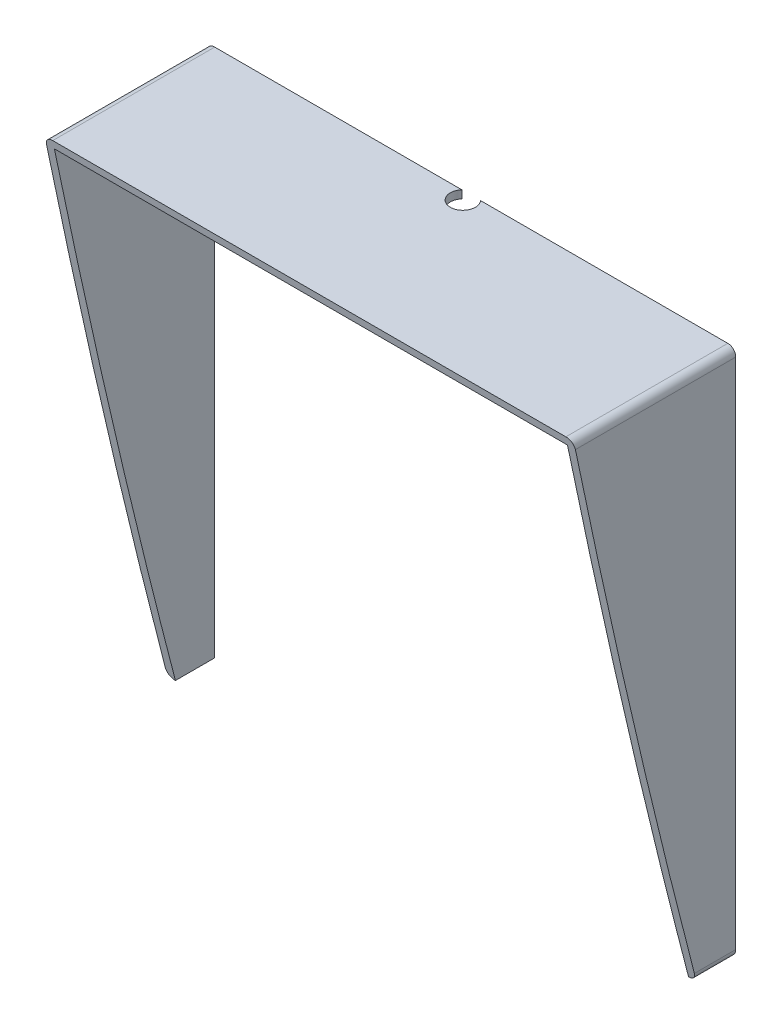
ISO-10303-21;
HEADER;
FILE_DESCRIPTION(('STEP AP214'),'2;1');
FILE_NAME('part.step','',(''),(''),'','','');
FILE_SCHEMA(('AUTOMOTIVE_DESIGN { 1 0 10303 214 1 1 1 1 }'));
ENDSEC;
DATA;
#1=APPLICATION_CONTEXT('core data for automotive mechanical design processes');
#2=APPLICATION_PROTOCOL_DEFINITION('international standard','automotive_design',2000,#1);
#3=PRODUCT_CONTEXT('',#1,'mechanical');
#4=PRODUCT('Part','Part','',(#3));
#5=PRODUCT_RELATED_PRODUCT_CATEGORY('part','',(#4));
#6=PRODUCT_DEFINITION_FORMATION('','',#4);
#7=PRODUCT_DEFINITION_CONTEXT('part definition',#1,'design');
#8=PRODUCT_DEFINITION('design','',#6,#7);
#9=PRODUCT_DEFINITION_SHAPE('','',#8);
#10=(LENGTH_UNIT() NAMED_UNIT(*) SI_UNIT(.MILLI.,.METRE.));
#11=(NAMED_UNIT(*) PLANE_ANGLE_UNIT() SI_UNIT($,.RADIAN.));
#12=(NAMED_UNIT(*) SI_UNIT($,.STERADIAN.) SOLID_ANGLE_UNIT());
#13=UNCERTAINTY_MEASURE_WITH_UNIT(LENGTH_MEASURE(1.E-05),#10,'distance_accuracy_value','');
#14=(GEOMETRIC_REPRESENTATION_CONTEXT(3) GLOBAL_UNCERTAINTY_ASSIGNED_CONTEXT((#13)) GLOBAL_UNIT_ASSIGNED_CONTEXT((#10,
#11,#12)) REPRESENTATION_CONTEXT('',''));
#15=CARTESIAN_POINT('',(0.,0.,0.));
#16=DIRECTION('',(0.,0.,1.));
#17=DIRECTION('',(1.,0.,0.));
#18=AXIS2_PLACEMENT_3D('',#15,#16,#17);
#19=CARTESIAN_POINT('',(-97.,97.,0.));
#20=DIRECTION('',(0.,0.,1.));
#21=DIRECTION('',(1.,0.,0.));
#22=AXIS2_PLACEMENT_3D('',#19,#20,#21);
#23=PLANE('',#22);
#24=DIRECTION('',(-1.,0.,0.));
#25=VECTOR('',#24,1.);
#26=CARTESIAN_POINT('',(97.,100.,0.));
#27=LINE('',#26,#25);
#28=CARTESIAN_POINT('',(-3.54044096437457,100.,0.));
#29=VERTEX_POINT('',#28);
#30=CARTESIAN_POINT('',(-97.,100.,0.));
#31=VERTEX_POINT('',#30);
#32=EDGE_CURVE('E202',#29,#31,#27,.T.);
#33=ORIENTED_EDGE('',*,*,#32,.F.);
#34=DIRECTION('',(0.,-1.,0.));
#35=VECTOR('',#34,1.);
#36=CARTESIAN_POINT('',(-3.54044096437457,107.,0.));
#37=LINE('',#36,#35);
#38=CARTESIAN_POINT('',(-3.54044096437457,97.,0.));
#39=VERTEX_POINT('',#38);
#40=EDGE_CURVE('E171',#29,#39,#37,.T.);
#41=ORIENTED_EDGE('',*,*,#40,.T.);
#42=DIRECTION('',(-1.,0.,0.));
#43=VECTOR('',#42,1.);
#44=CARTESIAN_POINT('',(97.,97.,0.));
#45=LINE('',#44,#43);
#46=CARTESIAN_POINT('',(-97.,97.,0.));
#47=VERTEX_POINT('',#46);
#48=EDGE_CURVE('E161',#39,#47,#45,.T.);
#49=ORIENTED_EDGE('',*,*,#48,.T.);
#50=DIRECTION('',(0.,-1.,0.));
#51=VECTOR('',#50,1.);
#52=CARTESIAN_POINT('',(-97.,97.,0.));
#53=LINE('',#52,#51);
#54=CARTESIAN_POINT('',(-97.,-100.,0.));
#55=VERTEX_POINT('',#54);
#56=EDGE_CURVE('E168',#47,#55,#53,.T.);
#57=ORIENTED_EDGE('',*,*,#56,.T.);
#58=CARTESIAN_POINT('',(-97.,-97.,0.));
#59=DIRECTION('',(0.,0.,1.));
#60=DIRECTION('',(1.,0.,0.));
#61=AXIS2_PLACEMENT_3D('',#58,#59,#60);
#62=CIRCLE('',#61,3.);
#63=CARTESIAN_POINT('',(-100.,-97.,0.));
#64=VERTEX_POINT('',#63);
#65=EDGE_CURVE('E184',#64,#55,#62,.T.);
#66=ORIENTED_EDGE('',*,*,#65,.F.);
#67=DIRECTION('',(0.,-1.,0.));
#68=VECTOR('',#67,1.);
#69=CARTESIAN_POINT('',(-100.,97.,0.));
#70=LINE('',#69,#68);
#71=CARTESIAN_POINT('',(-100.,97.,0.));
#72=VERTEX_POINT('',#71);
#73=EDGE_CURVE('E180',#72,#64,#70,.T.);
#74=ORIENTED_EDGE('',*,*,#73,.F.);
#75=CARTESIAN_POINT('',(-97.,97.,0.));
#76=DIRECTION('',(0.,0.,1.));
#77=DIRECTION('',(1.,0.,0.));
#78=AXIS2_PLACEMENT_3D('',#75,#76,#77);
#79=CIRCLE('',#78,3.);
#80=EDGE_CURVE('E206',#31,#72,#79,.T.);
#81=ORIENTED_EDGE('',*,*,#80,.F.);
#82=EDGE_LOOP('',(#33,#41,#49,#57,#66,#74,#81));
#83=FACE_BOUND('',#82,.T.);
#84=ADVANCED_FACE('F75',(#83),#23,.F.);
#85=CARTESIAN_POINT('',(97.,97.,0.));
#86=VERTEX_POINT('',#85);
#87=CARTESIAN_POINT('',(3.54044096437476,97.,0.));
#88=VERTEX_POINT('',#87);
#89=EDGE_CURVE('E156',#86,#88,#45,.T.);
#90=ORIENTED_EDGE('',*,*,#89,.T.);
#91=DIRECTION('',(0.,-1.,0.));
#92=VECTOR('',#91,1.);
#93=CARTESIAN_POINT('',(3.54044096437476,107.,0.));
#94=LINE('',#93,#92);
#95=CARTESIAN_POINT('',(3.54044096437476,100.,0.));
#96=VERTEX_POINT('',#95);
#97=EDGE_CURVE('E94',#88,#96,#94,.F.);
#98=ORIENTED_EDGE('',*,*,#97,.T.);
#99=CARTESIAN_POINT('',(97.,100.,0.));
#100=VERTEX_POINT('',#99);
#101=EDGE_CURVE('E153',#100,#96,#27,.T.);
#102=ORIENTED_EDGE('',*,*,#101,.F.);
#103=CARTESIAN_POINT('',(97.,97.,0.));
#104=DIRECTION('',(0.,0.,1.));
#105=DIRECTION('',(1.,0.,0.));
#106=AXIS2_PLACEMENT_3D('',#103,#104,#105);
#107=CIRCLE('',#106,3.);
#108=CARTESIAN_POINT('',(100.,97.,0.));
#109=VERTEX_POINT('',#108);
#110=EDGE_CURVE('E198',#109,#100,#107,.T.);
#111=ORIENTED_EDGE('',*,*,#110,.F.);
#112=DIRECTION('',(0.,1.,0.));
#113=VECTOR('',#112,1.);
#114=CARTESIAN_POINT('',(100.,-97.,0.));
#115=LINE('',#114,#113);
#116=CARTESIAN_POINT('',(100.,-97.,0.));
#117=VERTEX_POINT('',#116);
#118=EDGE_CURVE('E194',#117,#109,#115,.T.);
#119=ORIENTED_EDGE('',*,*,#118,.F.);
#120=CARTESIAN_POINT('',(97.,-97.,0.));
#121=DIRECTION('',(0.,0.,1.));
#122=DIRECTION('',(1.,0.,0.));
#123=AXIS2_PLACEMENT_3D('',#120,#121,#122);
#124=CIRCLE('',#123,3.);
#125=CARTESIAN_POINT('',(96.9999999999999,-100.,0.));
#126=VERTEX_POINT('',#125);
#127=EDGE_CURVE('E167',#126,#117,#124,.T.);
#128=ORIENTED_EDGE('',*,*,#127,.F.);
#129=DIRECTION('',(0.,1.,0.));
#130=VECTOR('',#129,1.);
#131=CARTESIAN_POINT('',(97.,-97.,0.));
#132=LINE('',#131,#130);
#133=EDGE_CURVE('E148',#126,#86,#132,.T.);
#134=ORIENTED_EDGE('',*,*,#133,.T.);
#135=EDGE_LOOP('',(#90,#98,#102,#111,#119,#128,#134));
#136=FACE_BOUND('',#135,.T.);
#137=ADVANCED_FACE('F164',(#136),#23,.F.);
#138=CARTESIAN_POINT('',(-97.,97.,233.360213599289));
#139=DIRECTION('',(0.,0.,-1.));
#140=DIRECTION('',(-1.,0.,0.));
#141=AXIS2_PLACEMENT_3D('',#138,#139,#140);
#142=CYLINDRICAL_SURFACE('',#141,3.);
#143=DIRECTION('',(0.,0.,-1.));
#144=VECTOR('',#143,1.);
#145=CARTESIAN_POINT('',(-100.,97.,233.360213599289));
#146=LINE('',#145,#144);
#147=CARTESIAN_POINT('',(-100.,97.0000000015854,60.6130762424719));
#148=VERTEX_POINT('',#147);
#149=EDGE_CURVE('E178',#148,#72,#146,.T.);
#150=ORIENTED_EDGE('',*,*,#149,.F.);
#151=CARTESIAN_POINT('',(-100.,97.,60.6130762421445));
#152=CARTESIAN_POINT('',(-100.000007100054,97.0856880026168,60.6307707751174));
#153=CARTESIAN_POINT('',(-99.9963287509131,97.1713732623864,60.6484621380416));
#154=CARTESIAN_POINT('',(-99.9816560796996,97.3421414551059,60.6837154599153));
#155=CARTESIAN_POINT('',(-99.9706617978497,97.4272243913647,60.7012774195757));
#156=CARTESIAN_POINT('',(-99.9414142967146,97.5961798555819,60.7361465513628));
#157=CARTESIAN_POINT('',(-99.9231621255235,97.6800525564959,60.7534537599033));
#158=CARTESIAN_POINT('',(-99.8795302255661,97.8459754505165,60.7876873670131));
#159=CARTESIAN_POINT('',(-99.8541506421178,97.9280256807439,60.8046137733386));
#160=CARTESIAN_POINT('',(-99.7674816393416,98.1706801868427,60.8546649831489));
#161=CARTESIAN_POINT('',(-99.6956564207911,98.3278202419441,60.8870683739158));
#162=CARTESIAN_POINT('',(-99.525885414694,98.6277678277151,60.9489046485199));
#163=CARTESIAN_POINT('',(-99.4279487932262,98.7705803637144,60.9783385697639));
#164=CARTESIAN_POINT('',(-99.2096127536016,99.0363903607402,61.0331109183102));
#165=CARTESIAN_POINT('',(-99.0894432692385,99.1595685676855,61.058486711257));
#166=CARTESIAN_POINT('',(-98.8292827857296,99.3839527654858,61.1047038732665));
#167=CARTESIAN_POINT('',(-98.6892888505607,99.4851554961139,61.1255445695146));
#168=CARTESIAN_POINT('',(-98.3964455527121,99.6605469856351,61.16165830404));
#169=CARTESIAN_POINT('',(-98.2439027497817,99.7352273616381,61.177032672776));
#170=CARTESIAN_POINT('',(-97.9280637731349,99.8578542143945,61.2022756745486));
#171=CARTESIAN_POINT('',(-97.7647772858595,99.9058244133696,61.212149193083));
#172=CARTESIAN_POINT('',(-97.5001599770955,99.9597244006013,61.2232428326046));
#173=CARTESIAN_POINT('',(-97.4006830354952,99.9748193261081,61.2263495344302));
#174=CARTESIAN_POINT('',(-97.200819910882,99.9949540541081,61.2304934197249));
#175=CARTESIAN_POINT('',(-97.1004352519509,100.000008375793,61.2315335914952));
#176=CARTESIAN_POINT('',(-97.0000000000001,100.,61.2315319001184));
#177=B_SPLINE_CURVE_WITH_KNOTS('',3,(#151,#152,#153,#154,#155,#156,#157,#158,#159,#160,#161,
#162,#163,#164,#165,#166,#167,#168,#169,#170,#171,#172,#173,#174,#175,#176),.UNSPECIFIED.,.F.,
.F.,(4,2,2,2,2,2,2,2,2,2,2,2,4),(0.,0.262404202490615,0.524806962316488,0.787171842958766,
1.04953137474283,1.57415237436955,2.09858945433025,2.61787860807826,3.13724474971434,
3.64640829512043,4.15511891072351,4.45662961662765,4.75770400537536),.UNSPECIFIED.);
#178=CARTESIAN_POINT('',(-97.0000000000001,99.9999999999999,61.2315319001184));
#179=VERTEX_POINT('',#178);
#180=EDGE_CURVE('E103',#148,#179,#177,.T.);
#181=ORIENTED_EDGE('',*,*,#180,.T.);
#182=DIRECTION('',(0.,0.,-1.));
#183=VECTOR('',#182,1.);
#184=CARTESIAN_POINT('',(-97.,100.,233.360213599289));
#185=LINE('',#184,#183);
#186=EDGE_CURVE('E204',#179,#31,#185,.T.);
#187=ORIENTED_EDGE('',*,*,#186,.T.);
#188=ORIENTED_EDGE('',*,*,#80,.T.);
#189=EDGE_LOOP('',(#150,#181,#187,#188));
#190=FACE_BOUND('',#189,.T.);
#191=ADVANCED_FACE('F219',(#190),#142,.T.);
#192=CARTESIAN_POINT('',(-100.,97.,233.360213599289));
#193=DIRECTION('',(1.,0.,0.));
#194=DIRECTION('',(0.,1.,0.));
#195=AXIS2_PLACEMENT_3D('',#192,#193,#194);
#196=PLANE('',#195);
#197=DIRECTION('',(0.,0.,-1.));
#198=VECTOR('',#197,1.);
#199=CARTESIAN_POINT('',(-100.,-97.,233.360213599289));
#200=LINE('',#199,#198);
#201=CARTESIAN_POINT('',(-100.,-97.,15.6242073781726));
#202=VERTEX_POINT('',#201);
#203=EDGE_CURVE('E182',#202,#64,#200,.T.);
#204=ORIENTED_EDGE('',*,*,#203,.F.);
#205=CARTESIAN_POINT('',(-100.,821.32936142745,227.601217320556));
#206=CARTESIAN_POINT('',(-100.,814.013340356773,232.250751676992));
#207=CARTESIAN_POINT('',(-100.,807.890062740785,233.357963599289));
#208=CARTESIAN_POINT('',(-100.,752.770792852457,214.336934546945));
#209=CARTESIAN_POINT('',(-100.,674.079077361076,175.267095142982));
#210=CARTESIAN_POINT('',(-100.,488.513772650182,127.413622560773));
#211=CARTESIAN_POINT('',(-100.,166.664225990946,81.1075939794665));
#212=CARTESIAN_POINT('',(-100.,-207.087491188463,0.397268381274574));
#213=CARTESIAN_POINT('',(-100.,-425.4,-93.8780602923125));
#214=B_SPLINE_CURVE_WITH_KNOTS('',3,(#205,#206,#207,#208,#209,#210,#211,#212,#213),
.UNSPECIFIED.,.F.,.F.,(4,1,1,1,1,1,4),(0.,0.0188245230898064,0.0375633418946969,
0.170740982920659,0.210775946768388,0.421265775243738,1.),.UNSPECIFIED.);
#215=EDGE_CURVE('E181',#202,#148,#214,.F.);
#216=ORIENTED_EDGE('',*,*,#215,.T.);
#217=ORIENTED_EDGE('',*,*,#149,.T.);
#218=ORIENTED_EDGE('',*,*,#73,.T.);
#219=EDGE_LOOP('',(#204,#216,#217,#218));
#220=FACE_BOUND('',#219,.T.);
#221=ADVANCED_FACE('F224',(#220),#196,.F.);
#222=CARTESIAN_POINT('',(-97.,-97.,233.360213599289));
#223=DIRECTION('',(0.,0.,-1.));
#224=DIRECTION('',(-1.,0.,0.));
#225=AXIS2_PLACEMENT_3D('',#222,#223,#224);
#226=CYLINDRICAL_SURFACE('',#225,3.);
#227=DIRECTION('',(0.,0.,-1.));
#228=VECTOR('',#227,1.);
#229=CARTESIAN_POINT('',(-97.,-100.,233.360213599289));
#230=LINE('',#229,#228);
#231=CARTESIAN_POINT('',(-97.0000000000002,-100.,14.8408458443055));
#232=VERTEX_POINT('',#231);
#233=EDGE_CURVE('E186',#232,#55,#230,.T.);
#234=ORIENTED_EDGE('',*,*,#233,.F.);
#235=CARTESIAN_POINT('',(-97.,-100.,14.8408458443055));
#236=CARTESIAN_POINT('',(-97.082392301401,-100.000009490196,14.8408433369679));
#237=CARTESIAN_POINT('',(-97.1647799083764,-99.9966058700731,14.8417338347966));
#238=CARTESIAN_POINT('',(-97.3289500804342,-99.9830455162141,14.8452815366397));
#239=CARTESIAN_POINT('',(-97.4107327132783,-99.9728895507387,14.8479385396668));
#240=CARTESIAN_POINT('',(-97.5729818090605,-99.9459199372928,14.8549941075903));
#241=CARTESIAN_POINT('',(-97.653450227733,-99.9291173450635,14.8593897804499));
#242=CARTESIAN_POINT('',(-97.8126148061725,-99.8890140831846,14.8698805877941));
#243=CARTESIAN_POINT('',(-97.8913109651344,-99.8657134105828,14.8759757230509));
#244=CARTESIAN_POINT('',(-98.1239374649887,-99.7863142304628,14.8967442836812));
#245=CARTESIAN_POINT('',(-98.2745259116123,-99.7206984069387,14.9139061375583));
#246=CARTESIAN_POINT('',(-98.5623117630588,-99.5662999868688,14.9542821334835));
#247=CARTESIAN_POINT('',(-98.6995080520835,-99.4775154622299,14.9774967792432));
#248=CARTESIAN_POINT('',(-98.9589197399221,-99.2781034043576,15.0296262744241));
#249=CARTESIAN_POINT('',(-99.0808981985866,-99.1671871446118,15.0586164617199));
#250=CARTESIAN_POINT('',(-99.3045872820295,-98.9276287373059,15.1212141384857));
#251=CARTESIAN_POINT('',(-99.406293038356,-98.798982344403,15.154822733792));
#252=CARTESIAN_POINT('',(-99.5898864424123,-98.5233987424396,15.2267983210333));
#253=CARTESIAN_POINT('',(-99.6710641423571,-98.3760189984249,15.2652803046912));
#254=CARTESIAN_POINT('',(-99.8075179427542,-98.0704352397623,15.3450459630727));
#255=CARTESIAN_POINT('',(-99.8627975511805,-97.912232694424,15.3863292574828));
#256=CARTESIAN_POINT('',(-99.9362520818087,-97.6280958586719,15.4604515884955));
#257=CARTESIAN_POINT('',(-99.9601441447508,-97.5035136825579,15.4929434882032));
#258=CARTESIAN_POINT('',(-99.9920186416349,-97.2526331975978,15.5583589698145));
#259=CARTESIAN_POINT('',(-100.000023559898,-97.1263375691372,15.5912818751695));
#260=CARTESIAN_POINT('',(-100.,-97.,15.6242073781726));
#261=B_SPLINE_CURVE_WITH_KNOTS('',3,(#235,#236,#237,#238,#239,#240,#241,#242,#243,#244,#245,
#246,#247,#248,#249,#250,#251,#252,#253,#254,#255,#256,#257,#258,#259,#260),.UNSPECIFIED.,.F.,
.F.,(4,2,2,2,2,2,2,2,2,2,2,2,4),(0.,0.247093587719547,0.494159066725783,0.740815303101802,
0.987471651539334,1.48042332805695,1.97341604097017,2.47331895925039,2.97334178403566,
3.48882409732194,4.00423656678551,4.39613879672963,4.78748598942122),.UNSPECIFIED.);
#262=EDGE_CURVE('E185',#232,#202,#261,.T.);
#263=ORIENTED_EDGE('',*,*,#262,.T.);
#264=ORIENTED_EDGE('',*,*,#203,.T.);
#265=ORIENTED_EDGE('',*,*,#65,.T.);
#266=EDGE_LOOP('',(#234,#263,#264,#265));
#267=FACE_BOUND('',#266,.T.);
#268=ADVANCED_FACE('F339',(#267),#226,.T.);
#269=CARTESIAN_POINT('',(97.,-97.,233.360213599289));
#270=DIRECTION('',(0.,0.,-1.));
#271=DIRECTION('',(-1.,0.,0.));
#272=AXIS2_PLACEMENT_3D('',#269,#270,#271);
#273=CYLINDRICAL_SURFACE('',#272,3.);
#274=DIRECTION('',(0.,0.,-1.));
#275=VECTOR('',#274,1.);
#276=CARTESIAN_POINT('',(100.,-97.,233.360213599289));
#277=LINE('',#276,#275);
#278=CARTESIAN_POINT('',(99.9999999999999,-97.0000000029362,15.6242073774073));
#279=VERTEX_POINT('',#278);
#280=EDGE_CURVE('E192',#279,#117,#277,.T.);
#281=ORIENTED_EDGE('',*,*,#280,.F.);
#282=CARTESIAN_POINT('',(100.,-97.,15.6242073781726));
#283=CARTESIAN_POINT('',(100.000006492503,-97.0864954464646,15.6016652732155));
#284=CARTESIAN_POINT('',(99.9962592013464,-97.1729869554062,15.5791203601685));
#285=CARTESIAN_POINT('',(99.9813082142559,-97.3453640758507,15.5341810346435));
#286=CARTESIAN_POINT('',(99.9701043895374,-97.4312496768629,15.5117866247716));
#287=CARTESIAN_POINT('',(99.9402882521572,-97.6018325179434,15.467300364239));
#288=CARTESIAN_POINT('',(99.921674325267,-97.6865294949154,15.4452085805882));
#289=CARTESIAN_POINT('',(99.8771627053963,-97.8540837243244,15.401497876626));
#290=CARTESIAN_POINT('',(99.8512651913195,-97.9369410218947,15.3798789447142));
#291=CARTESIAN_POINT('',(99.7627864775551,-98.1819992478645,15.3159289072289));
#292=CARTESIAN_POINT('',(99.6894169837518,-98.3406986427169,15.2745013955485));
#293=CARTESIAN_POINT('',(99.5158186015368,-98.6435135609017,15.1954311195241));
#294=CARTESIAN_POINT('',(99.4156018471881,-98.7876356322583,15.1577866559125));
#295=CARTESIAN_POINT('',(99.192614687147,-99.0548048008822,15.0879854174616));
#296=CARTESIAN_POINT('',(99.0702238668954,-99.1781477595502,15.0557516324786));
#297=CARTESIAN_POINT('',(98.8051189773957,-99.4024327535476,14.9971266269117));
#298=CARTESIAN_POINT('',(98.662402661511,-99.5033723094035,14.9707360530201));
#299=CARTESIAN_POINT('',(98.3655563277829,-99.6765401554903,14.9254547931294));
#300=CARTESIAN_POINT('',(98.2119255340124,-99.7495705902181,14.9063545959361));
#301=CARTESIAN_POINT('',(97.8939698419028,-99.8687213924199,14.8751893832268));
#302=CARTESIAN_POINT('',(97.7296566317682,-99.9148706390132,14.8631168177626));
#303=CARTESIAN_POINT('',(97.469920894112,-99.9644743536439,14.8501400983555));
#304=CARTESIAN_POINT('',(97.3764003233928,-99.9777897135211,14.8466565613292));
#305=CARTESIAN_POINT('',(97.18860218304,-99.9955487321418,14.8420104118401));
#306=CARTESIAN_POINT('',(97.0943259236797,-100.000005364093,14.8408444054583));
#307=CARTESIAN_POINT('',(97.,-99.9999999999999,14.8408458443055));
#308=B_SPLINE_CURVE_WITH_KNOTS('',3,(#282,#283,#284,#285,#286,#287,#288,#289,#290,#291,#292,
#293,#294,#295,#296,#297,#298,#299,#300,#301,#302,#303,#304,#305,#306,#307),.UNSPECIFIED.,.F.,
.F.,(4,2,2,2,2,2,2,2,2,2,2,2,4),(0.,0.26806947746696,0.536143584972862,0.804276122151919,
1.07240207387375,1.6086163065243,2.14458859597983,2.67212963302886,3.19972902605742,
3.71075865870553,4.22123826225042,4.50442128557257,4.78718929367573),.UNSPECIFIED.);
#309=CARTESIAN_POINT('',(97.,-100.,14.8408458443055));
#310=VERTEX_POINT('',#309);
#311=EDGE_CURVE('E189',#279,#310,#308,.T.);
#312=ORIENTED_EDGE('',*,*,#311,.T.);
#313=DIRECTION('',(0.,0.,-1.));
#314=VECTOR('',#313,1.);
#315=CARTESIAN_POINT('',(97.,-100.,233.360213599289));
#316=LINE('',#315,#314);
#317=EDGE_CURVE('E190',#310,#126,#316,.T.);
#318=ORIENTED_EDGE('',*,*,#317,.T.);
#319=ORIENTED_EDGE('',*,*,#127,.T.);
#320=EDGE_LOOP('',(#281,#312,#318,#319));
#321=FACE_BOUND('',#320,.T.);
#322=ADVANCED_FACE('F397',(#321),#273,.T.);
#323=CARTESIAN_POINT('',(100.,-97.,233.360213599289));
#324=DIRECTION('',(-1.,0.,0.));
#325=DIRECTION('',(0.,-1.,0.));
#326=AXIS2_PLACEMENT_3D('',#323,#324,#325);
#327=PLANE('',#326);
#328=DIRECTION('',(0.,0.,-1.));
#329=VECTOR('',#328,1.);
#330=CARTESIAN_POINT('',(100.,97.,233.360213599289));
#331=LINE('',#330,#329);
#332=CARTESIAN_POINT('',(99.9999999999999,97.,60.6130762421445));
#333=VERTEX_POINT('',#332);
#334=EDGE_CURVE('E196',#333,#109,#331,.T.);
#335=ORIENTED_EDGE('',*,*,#334,.F.);
#336=CARTESIAN_POINT('',(99.9999999999998,821.32936142745,227.601217320556));
#337=CARTESIAN_POINT('',(99.9999999999998,814.013340356773,232.250751676992));
#338=CARTESIAN_POINT('',(99.9999999999998,807.890062740785,233.357963599289));
#339=CARTESIAN_POINT('',(99.9999999999998,752.770792852457,214.336934546945));
#340=CARTESIAN_POINT('',(99.9999999999998,674.079077361076,175.267095142982));
#341=CARTESIAN_POINT('',(99.9999999999998,488.513772650182,127.413622560773));
#342=CARTESIAN_POINT('',(99.9999999999998,166.664225990946,81.1075939794665));
#343=CARTESIAN_POINT('',(99.9999999999999,-207.087491188463,0.397268381274574));
#344=CARTESIAN_POINT('',(99.9999999999999,-425.4,-93.8780602923125));
#345=B_SPLINE_CURVE_WITH_KNOTS('',3,(#336,#337,#338,#339,#340,#341,#342,#343,#344),
.UNSPECIFIED.,.F.,.F.,(4,1,1,1,1,1,4),(0.,0.0188245230898064,0.0375633418946969,
0.170740982920659,0.210775946768388,0.421265775243738,1.),.UNSPECIFIED.);
#346=EDGE_CURVE('E195',#333,#279,#345,.T.);
#347=ORIENTED_EDGE('',*,*,#346,.T.);
#348=ORIENTED_EDGE('',*,*,#280,.T.);
#349=ORIENTED_EDGE('',*,*,#118,.T.);
#350=EDGE_LOOP('',(#335,#347,#348,#349));
#351=FACE_BOUND('',#350,.T.);
#352=ADVANCED_FACE('F256',(#351),#327,.F.);
#353=CARTESIAN_POINT('',(97.,97.,233.360213599289));
#354=DIRECTION('',(0.,0.,-1.));
#355=DIRECTION('',(-1.,0.,0.));
#356=AXIS2_PLACEMENT_3D('',#353,#354,#355);
#357=CYLINDRICAL_SURFACE('',#356,3.);
#358=DIRECTION('',(0.,0.,-1.));
#359=VECTOR('',#358,1.);
#360=CARTESIAN_POINT('',(97.,100.,233.360213599289));
#361=LINE('',#360,#359);
#362=CARTESIAN_POINT('',(97.,100.,61.2315319001185));
#363=VERTEX_POINT('',#362);
#364=EDGE_CURVE('E200',#363,#100,#361,.T.);
#365=ORIENTED_EDGE('',*,*,#364,.F.);
#366=CARTESIAN_POINT('',(97.,100.,61.2315319001184));
#367=CARTESIAN_POINT('',(97.0831224657888,100.000008987514,61.2315337324498));
#368=CARTESIAN_POINT('',(97.1662405610942,99.9965454123548,61.2308209277612));
#369=CARTESIAN_POINT('',(97.3318723384336,99.9827424667997,61.2279801870044));
#370=CARTESIAN_POINT('',(97.4143860736197,99.9724037085864,61.2258523769315));
#371=CARTESIAN_POINT('',(97.5781198058384,99.9449379319452,61.2201995149477));
#372=CARTESIAN_POINT('',(97.6593413737503,99.9278199358752,61.216676320127));
#373=CARTESIAN_POINT('',(97.8200016999086,99.8869495410974,61.208264108728));
#374=CARTESIAN_POINT('',(97.8994404658761,99.8631971711288,61.2033750980662));
#375=CARTESIAN_POINT('',(98.1342882224438,99.7822200471977,61.1867065371339));
#376=CARTESIAN_POINT('',(98.2863294427424,99.7152582386181,61.172921951423));
#377=CARTESIAN_POINT('',(98.576820776279,99.5575371132249,61.1404488865457));
#378=CARTESIAN_POINT('',(98.715271061502,99.4667780976039,61.1217604694452));
#379=CARTESIAN_POINT('',(98.9761804482698,99.2632523039286,61.0798439921657));
#380=CARTESIAN_POINT('',(99.0984862786555,99.1502968646194,61.0565770133532));
#381=CARTESIAN_POINT('',(99.3224627518888,98.9062052831485,61.0062869243345));
#382=CARTESIAN_POINT('',(99.4241287130072,98.7750650274638,60.9792629642712));
#383=CARTESIAN_POINT('',(99.6060449472278,98.4956174015011,60.9216631832634));
#384=CARTESIAN_POINT('',(99.685837013946,98.3470242174196,60.8910281859818));
#385=CARTESIAN_POINT('',(99.8193257543829,98.0390149493024,60.8275096489602));
#386=CARTESIAN_POINT('',(99.8730301384007,97.8796020789546,60.7946267768683));
#387=CARTESIAN_POINT('',(99.9419430766247,97.5996673119785,60.7368669933999));
#388=CARTESIAN_POINT('',(99.9637018980846,97.4806475537353,60.7123044566271));
#389=CARTESIAN_POINT('',(99.9927301782327,97.2410981598814,60.6628577725111));
#390=CARTESIAN_POINT('',(100.000020102375,97.1205708998927,60.6379741296047));
#391=CARTESIAN_POINT('',(100.,97.0000000000001,60.6130762421445));
#392=B_SPLINE_CURVE_WITH_KNOTS('',3,(#366,#367,#368,#369,#370,#371,#372,#373,#374,#375,#376,
#377,#378,#379,#380,#381,#382,#383,#384,#385,#386,#387,#388,#389,#390,#391),.UNSPECIFIED.,.F.,
.F.,(4,2,2,2,2,2,2,2,2,2,2,2,4),(0.,0.249284473710586,0.498546753520265,0.747478403797993,
0.996408975762088,1.49396719978688,1.99151912670219,2.49349880684254,2.9955922238288,
3.50751486805476,4.01928611969083,4.38884913927847,4.75788905884878),.UNSPECIFIED.);
#393=EDGE_CURVE('E199',#363,#333,#392,.T.);
#394=ORIENTED_EDGE('',*,*,#393,.T.);
#395=ORIENTED_EDGE('',*,*,#334,.T.);
#396=ORIENTED_EDGE('',*,*,#110,.T.);
#397=EDGE_LOOP('',(#365,#394,#395,#396));
#398=FACE_BOUND('',#397,.T.);
#399=ADVANCED_FACE('F238',(#398),#357,.T.);
#400=CARTESIAN_POINT('',(97.,100.,233.360213599289));
#401=DIRECTION('',(0.,-1.,0.));
#402=DIRECTION('',(0.,0.,-1.));
#403=AXIS2_PLACEMENT_3D('',#400,#401,#402);
#404=PLANE('',#403);
#405=ORIENTED_EDGE('',*,*,#101,.T.);
#406=CARTESIAN_POINT('',(0.,100.,3.16666666666667));
#407=DIRECTION('',(0.,-1.,0.));
#408=DIRECTION('',(0.,0.,-1.));
#409=AXIS2_PLACEMENT_3D('',#406,#407,#408);
#410=CIRCLE('',#409,4.75);
#411=EDGE_CURVE('E299',#96,#29,#410,.T.);
#412=ORIENTED_EDGE('',*,*,#411,.T.);
#413=ORIENTED_EDGE('',*,*,#32,.T.);
#414=ORIENTED_EDGE('',*,*,#186,.F.);
#415=DIRECTION('',(-1.,0.,0.));
#416=VECTOR('',#415,1.);
#417=CARTESIAN_POINT('',(0.,99.9999999999999,61.2315319001184));
#418=LINE('',#417,#416);
#419=EDGE_CURVE('E203',#179,#363,#418,.F.);
#420=ORIENTED_EDGE('',*,*,#419,.T.);
#421=ORIENTED_EDGE('',*,*,#364,.T.);
#422=EDGE_LOOP('',(#405,#412,#413,#414,#420,#421));
#423=FACE_BOUND('',#422,.T.);
#424=ADVANCED_FACE('F232',(#423),#404,.F.);
#425=CARTESIAN_POINT('',(-97.,97.,233.360213599289));
#426=DIRECTION('',(1.,0.,0.));
#427=DIRECTION('',(0.,1.,0.));
#428=AXIS2_PLACEMENT_3D('',#425,#426,#427);
#429=PLANE('',#428);
#430=CARTESIAN_POINT('',(-97.0000000000003,821.32936142745,227.601217320556));
#431=CARTESIAN_POINT('',(-97.0000000000003,814.013340356773,232.250751676992));
#432=CARTESIAN_POINT('',(-97.0000000000003,807.890062740785,233.357963599289));
#433=CARTESIAN_POINT('',(-97.0000000000003,752.770792852457,214.336934546945));
#434=CARTESIAN_POINT('',(-97.0000000000003,674.079077361076,175.267095142982));
#435=CARTESIAN_POINT('',(-97.0000000000003,488.513772650182,127.413622560773));
#436=CARTESIAN_POINT('',(-97.0000000000003,166.664225990946,81.1075939794665));
#437=CARTESIAN_POINT('',(-97.0000000000002,-207.087491188463,0.397268381274574));
#438=CARTESIAN_POINT('',(-97.0000000000002,-425.4,-93.8780602923125));
#439=B_SPLINE_CURVE_WITH_KNOTS('',3,(#430,#431,#432,#433,#434,#435,#436,#437,#438),
.UNSPECIFIED.,.F.,.F.,(4,1,1,1,1,1,4),(0.,0.0188245230898064,0.0375633418946969,
0.170740982920659,0.210775946768388,0.421265775243738,1.),.UNSPECIFIED.);
#440=CARTESIAN_POINT('',(-97.,97.,60.6130762421445));
#441=VERTEX_POINT('',#440);
#442=EDGE_CURVE('E177',#232,#441,#439,.F.);
#443=ORIENTED_EDGE('',*,*,#442,.F.);
#444=ORIENTED_EDGE('',*,*,#233,.T.);
#445=ORIENTED_EDGE('',*,*,#56,.F.);
#446=DIRECTION('',(0.,0.,-1.));
#447=VECTOR('',#446,1.);
#448=CARTESIAN_POINT('',(-97.,97.,233.360213599289));
#449=LINE('',#448,#447);
#450=EDGE_CURVE('E152',#441,#47,#449,.T.);
#451=ORIENTED_EDGE('',*,*,#450,.F.);
#452=EDGE_LOOP('',(#443,#444,#445,#451));
#453=FACE_BOUND('',#452,.T.);
#454=ADVANCED_FACE('F230',(#453),#429,.T.);
#455=CARTESIAN_POINT('',(97.,-97.,233.360213599289));
#456=DIRECTION('',(-1.,0.,0.));
#457=DIRECTION('',(0.,-1.,0.));
#458=AXIS2_PLACEMENT_3D('',#455,#456,#457);
#459=PLANE('',#458);
#460=CARTESIAN_POINT('',(96.9999999999998,821.32936142745,227.601217320556));
#461=CARTESIAN_POINT('',(96.9999999999998,814.013340356773,232.250751676992));
#462=CARTESIAN_POINT('',(96.9999999999998,807.890062740785,233.357963599289));
#463=CARTESIAN_POINT('',(96.9999999999998,752.770792852457,214.336934546945));
#464=CARTESIAN_POINT('',(96.9999999999998,674.079077361076,175.267095142982));
#465=CARTESIAN_POINT('',(96.9999999999998,488.513772650182,127.413622560773));
#466=CARTESIAN_POINT('',(96.9999999999998,166.664225990946,81.1075939794665));
#467=CARTESIAN_POINT('',(96.9999999999999,-207.087491188463,0.397268381274574));
#468=CARTESIAN_POINT('',(96.9999999999999,-425.4,-93.8780602923125));
#469=B_SPLINE_CURVE_WITH_KNOTS('',3,(#460,#461,#462,#463,#464,#465,#466,#467,#468),
.UNSPECIFIED.,.F.,.F.,(4,1,1,1,1,1,4),(0.,0.0188245230898064,0.0375633418946969,
0.170740982920659,0.210775946768388,0.421265775243738,1.),.UNSPECIFIED.);
#470=CARTESIAN_POINT('',(97.,96.9999999999999,60.6130762421445));
#471=VERTEX_POINT('',#470);
#472=EDGE_CURVE('E12',#471,#310,#469,.T.);
#473=ORIENTED_EDGE('',*,*,#472,.F.);
#474=DIRECTION('',(0.,0.,-1.));
#475=VECTOR('',#474,1.);
#476=CARTESIAN_POINT('',(97.,97.,233.360213599289));
#477=LINE('',#476,#475);
#478=EDGE_CURVE('E143',#471,#86,#477,.T.);
#479=ORIENTED_EDGE('',*,*,#478,.T.);
#480=ORIENTED_EDGE('',*,*,#133,.F.);
#481=ORIENTED_EDGE('',*,*,#317,.F.);
#482=EDGE_LOOP('',(#473,#479,#480,#481));
#483=FACE_BOUND('',#482,.T.);
#484=ADVANCED_FACE('F145',(#483),#459,.T.);
#485=CARTESIAN_POINT('',(97.,97.,233.360213599289));
#486=DIRECTION('',(0.,-1.,0.));
#487=DIRECTION('',(0.,0.,-1.));
#488=AXIS2_PLACEMENT_3D('',#485,#486,#487);
#489=PLANE('',#488);
#490=CARTESIAN_POINT('',(0.,97.,3.16666666666667));
#491=DIRECTION('',(0.,-1.,0.));
#492=DIRECTION('',(0.,0.,-1.));
#493=AXIS2_PLACEMENT_3D('',#490,#491,#492);
#494=CIRCLE('',#493,4.75);
#495=EDGE_CURVE('E159',#88,#39,#494,.T.);
#496=ORIENTED_EDGE('',*,*,#495,.F.);
#497=ORIENTED_EDGE('',*,*,#89,.F.);
#498=ORIENTED_EDGE('',*,*,#478,.F.);
#499=DIRECTION('',(-1.,0.,0.));
#500=VECTOR('',#499,1.);
#501=CARTESIAN_POINT('',(0.,96.9999999999999,60.6130762421445));
#502=LINE('',#501,#500);
#503=EDGE_CURVE('E87',#441,#471,#502,.F.);
#504=ORIENTED_EDGE('',*,*,#503,.F.);
#505=ORIENTED_EDGE('',*,*,#450,.T.);
#506=ORIENTED_EDGE('',*,*,#48,.F.);
#507=EDGE_LOOP('',(#496,#497,#498,#504,#505,#506));
#508=FACE_BOUND('',#507,.T.);
#509=ADVANCED_FACE('F157',(#508),#489,.T.);
#510=CARTESIAN_POINT('',(300.,821.32936142745,227.601217320556));
#511=CARTESIAN_POINT('',(300.,814.013340356773,232.250751676992));
#512=CARTESIAN_POINT('',(300.,807.890062740785,233.357963599289));
#513=CARTESIAN_POINT('',(300.,752.770792852457,214.336934546945));
#514=CARTESIAN_POINT('',(300.,674.079077361076,175.267095142982));
#515=CARTESIAN_POINT('',(300.,488.513772650182,127.413622560773));
#516=CARTESIAN_POINT('',(300.,166.664225990946,81.1075939794665));
#517=CARTESIAN_POINT('',(300.,-207.087491188463,0.397268381274574));
#518=CARTESIAN_POINT('',(300.,-425.4,-93.8780602923125));
#519=B_SPLINE_CURVE_WITH_KNOTS('',3,(#510,#511,#512,#513,#514,#515,#516,#517,#518),
.UNSPECIFIED.,.F.,.F.,(4,1,1,1,1,1,4),(0.,0.0188245230898064,0.0375633418946969,
0.170740982920659,0.210775946768388,0.421265775243738,1.),.UNSPECIFIED.);
#520=DIRECTION('',(-1.,0.,0.));
#521=VECTOR('',#520,1.);
#522=SURFACE_OF_LINEAR_EXTRUSION('',#519,#521);
#523=ORIENTED_EDGE('',*,*,#472,.T.);
#524=ORIENTED_EDGE('',*,*,#311,.F.);
#525=ORIENTED_EDGE('',*,*,#346,.F.);
#526=ORIENTED_EDGE('',*,*,#393,.F.);
#527=ORIENTED_EDGE('',*,*,#419,.F.);
#528=ORIENTED_EDGE('',*,*,#180,.F.);
#529=ORIENTED_EDGE('',*,*,#215,.F.);
#530=ORIENTED_EDGE('',*,*,#262,.F.);
#531=ORIENTED_EDGE('',*,*,#442,.T.);
#532=ORIENTED_EDGE('',*,*,#503,.T.);
#533=EDGE_LOOP('',(#523,#524,#525,#526,#527,#528,#529,#530,#531,#532));
#534=FACE_BOUND('',#533,.T.);
#535=ADVANCED_FACE('F77',(#534),#522,.F.);
#536=CARTESIAN_POINT('',(0.,107.,3.16666666666667));
#537=DIRECTION('',(0.,-1.,0.));
#538=DIRECTION('',(0.,0.,-1.));
#539=AXIS2_PLACEMENT_3D('',#536,#537,#538);
#540=CYLINDRICAL_SURFACE('',#539,4.75);
#541=ORIENTED_EDGE('',*,*,#411,.F.);
#542=ORIENTED_EDGE('',*,*,#97,.F.);
#543=ORIENTED_EDGE('',*,*,#495,.T.);
#544=ORIENTED_EDGE('',*,*,#40,.F.);
#545=EDGE_LOOP('',(#541,#542,#543,#544));
#546=FACE_BOUND('',#545,.T.);
#547=ADVANCED_FACE('F251',(#546),#540,.F.);
#548=CLOSED_SHELL('',(#84,#137,#191,#221,#268,#322,#352,#399,#424,#454,#484,#509,#535,#547));
#549=MANIFOLD_SOLID_BREP('B2',#548);
#550=ADVANCED_BREP_SHAPE_REPRESENTATION('',(#18,#549),#14);
#551=SHAPE_DEFINITION_REPRESENTATION(#9,#550);
ENDSEC;
END-ISO-10303-21;
